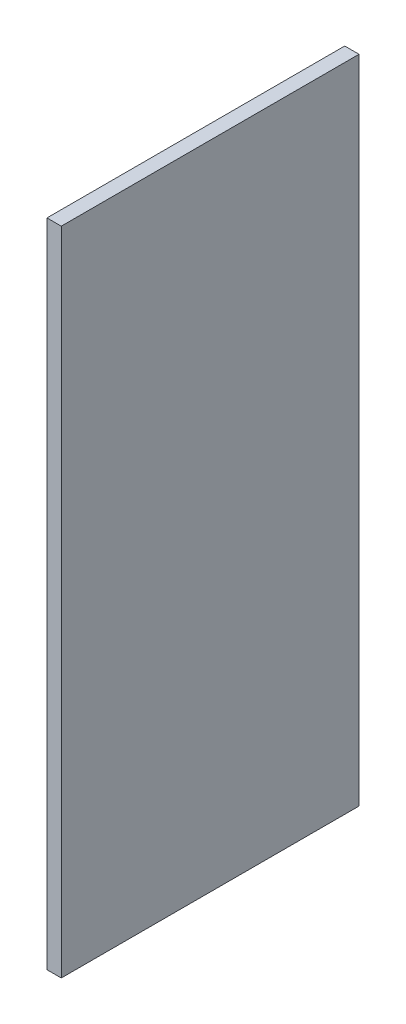
ISO-10303-21;
HEADER;
FILE_DESCRIPTION(('STEP AP214'),'2;1');
FILE_NAME('part.step','',(''),(''),'','','');
FILE_SCHEMA(('AUTOMOTIVE_DESIGN { 1 0 10303 214 1 1 1 1 }'));
ENDSEC;
DATA;
#1=APPLICATION_CONTEXT('core data for automotive mechanical design processes');
#2=APPLICATION_PROTOCOL_DEFINITION('international standard','automotive_design',2000,#1);
#3=PRODUCT_CONTEXT('',#1,'mechanical');
#4=PRODUCT('Part','Part','',(#3));
#5=PRODUCT_RELATED_PRODUCT_CATEGORY('part','',(#4));
#6=PRODUCT_DEFINITION_FORMATION('','',#4);
#7=PRODUCT_DEFINITION_CONTEXT('part definition',#1,'design');
#8=PRODUCT_DEFINITION('design','',#6,#7);
#9=PRODUCT_DEFINITION_SHAPE('','',#8);
#10=(LENGTH_UNIT() NAMED_UNIT(*) SI_UNIT(.MILLI.,.METRE.));
#11=(NAMED_UNIT(*) PLANE_ANGLE_UNIT() SI_UNIT($,.RADIAN.));
#12=(NAMED_UNIT(*) SI_UNIT($,.STERADIAN.) SOLID_ANGLE_UNIT());
#13=UNCERTAINTY_MEASURE_WITH_UNIT(LENGTH_MEASURE(1.E-05),#10,'distance_accuracy_value','');
#14=(GEOMETRIC_REPRESENTATION_CONTEXT(3) GLOBAL_UNCERTAINTY_ASSIGNED_CONTEXT((#13)) GLOBAL_UNIT_ASSIGNED_CONTEXT((#10,
#11,#12)) REPRESENTATION_CONTEXT('',''));
#15=CARTESIAN_POINT('',(0.,0.,0.));
#16=DIRECTION('',(0.,0.,1.));
#17=DIRECTION('',(1.,0.,0.));
#18=AXIS2_PLACEMENT_3D('',#15,#16,#17);
#19=CARTESIAN_POINT('',(185.,870.,187.5));
#20=DIRECTION('',(1.,0.,0.));
#21=DIRECTION('',(0.,0.,-1.));
#22=AXIS2_PLACEMENT_3D('',#19,#20,#21);
#23=PLANE('',#22);
#24=DIRECTION('',(0.,0.,1.));
#25=VECTOR('',#24,1.);
#26=CARTESIAN_POINT('',(185.,50.,187.5));
#27=LINE('',#26,#25);
#28=CARTESIAN_POINT('',(185.,50.,-187.5));
#29=VERTEX_POINT('',#28);
#30=CARTESIAN_POINT('',(185.,50.,187.5));
#31=VERTEX_POINT('',#30);
#32=EDGE_CURVE('E107',#29,#31,#27,.T.);
#33=ORIENTED_EDGE('',*,*,#32,.T.);
#34=DIRECTION('',(0.,-1.,0.));
#35=VECTOR('',#34,1.);
#36=CARTESIAN_POINT('',(185.,870.,187.5));
#37=LINE('',#36,#35);
#38=CARTESIAN_POINT('',(185.,870.,187.5));
#39=VERTEX_POINT('',#38);
#40=EDGE_CURVE('E11',#39,#31,#37,.T.);
#41=ORIENTED_EDGE('',*,*,#40,.F.);
#42=DIRECTION('',(0.,0.,1.));
#43=VECTOR('',#42,1.);
#44=CARTESIAN_POINT('',(185.,870.,187.5));
#45=LINE('',#44,#43);
#46=CARTESIAN_POINT('',(185.,870.,-187.5));
#47=VERTEX_POINT('',#46);
#48=EDGE_CURVE('E91',#47,#39,#45,.T.);
#49=ORIENTED_EDGE('',*,*,#48,.F.);
#50=DIRECTION('',(0.,-1.,0.));
#51=VECTOR('',#50,1.);
#52=CARTESIAN_POINT('',(185.,870.,-187.5));
#53=LINE('',#52,#51);
#54=EDGE_CURVE('E103',#47,#29,#53,.T.);
#55=ORIENTED_EDGE('',*,*,#54,.T.);
#56=EDGE_LOOP('',(#33,#41,#49,#55));
#57=FACE_BOUND('',#56,.T.);
#58=ADVANCED_FACE('F39',(#57),#23,.F.);
#59=CARTESIAN_POINT('',(185.,870.,187.5));
#60=DIRECTION('',(0.,0.,-1.));
#61=DIRECTION('',(-1.,0.,0.));
#62=AXIS2_PLACEMENT_3D('',#59,#60,#61);
#63=PLANE('',#62);
#64=DIRECTION('',(1.,0.,0.));
#65=VECTOR('',#64,1.);
#66=CARTESIAN_POINT('',(185.,50.,187.5));
#67=LINE('',#66,#65);
#68=CARTESIAN_POINT('',(203.,50.,187.5));
#69=VERTEX_POINT('',#68);
#70=EDGE_CURVE('E96',#31,#69,#67,.T.);
#71=ORIENTED_EDGE('',*,*,#70,.T.);
#72=DIRECTION('',(0.,-1.,0.));
#73=VECTOR('',#72,1.);
#74=CARTESIAN_POINT('',(203.,870.,187.5));
#75=LINE('',#74,#73);
#76=CARTESIAN_POINT('',(203.,870.,187.5));
#77=VERTEX_POINT('',#76);
#78=EDGE_CURVE('E48',#77,#69,#75,.T.);
#79=ORIENTED_EDGE('',*,*,#78,.F.);
#80=DIRECTION('',(1.,0.,0.));
#81=VECTOR('',#80,1.);
#82=CARTESIAN_POINT('',(185.,870.,187.5));
#83=LINE('',#82,#81);
#84=EDGE_CURVE('E86',#39,#77,#83,.T.);
#85=ORIENTED_EDGE('',*,*,#84,.F.);
#86=ORIENTED_EDGE('',*,*,#40,.T.);
#87=EDGE_LOOP('',(#71,#79,#85,#86));
#88=FACE_BOUND('',#87,.T.);
#89=ADVANCED_FACE('F95',(#88),#63,.F.);
#90=CARTESIAN_POINT('',(203.,870.,187.5));
#91=DIRECTION('',(-1.,0.,0.));
#92=DIRECTION('',(0.,0.,1.));
#93=AXIS2_PLACEMENT_3D('',#90,#91,#92);
#94=PLANE('',#93);
#95=DIRECTION('',(0.,0.,-1.));
#96=VECTOR('',#95,1.);
#97=CARTESIAN_POINT('',(203.,50.,187.5));
#98=LINE('',#97,#96);
#99=CARTESIAN_POINT('',(203.,50.,-187.5));
#100=VERTEX_POINT('',#99);
#101=EDGE_CURVE('E73',#69,#100,#98,.T.);
#102=ORIENTED_EDGE('',*,*,#101,.T.);
#103=DIRECTION('',(0.,-1.,0.));
#104=VECTOR('',#103,1.);
#105=CARTESIAN_POINT('',(203.,870.,-187.5));
#106=LINE('',#105,#104);
#107=CARTESIAN_POINT('',(203.,870.,-187.5));
#108=VERTEX_POINT('',#107);
#109=EDGE_CURVE('E98',#108,#100,#106,.T.);
#110=ORIENTED_EDGE('',*,*,#109,.F.);
#111=DIRECTION('',(0.,0.,-1.));
#112=VECTOR('',#111,1.);
#113=CARTESIAN_POINT('',(203.,870.,187.5));
#114=LINE('',#113,#112);
#115=EDGE_CURVE('E89',#77,#108,#114,.T.);
#116=ORIENTED_EDGE('',*,*,#115,.F.);
#117=ORIENTED_EDGE('',*,*,#78,.T.);
#118=EDGE_LOOP('',(#102,#110,#116,#117));
#119=FACE_BOUND('',#118,.T.);
#120=ADVANCED_FACE('F99',(#119),#94,.F.);
#121=CARTESIAN_POINT('',(185.,870.,-187.5));
#122=DIRECTION('',(0.,0.,1.));
#123=DIRECTION('',(1.,0.,0.));
#124=AXIS2_PLACEMENT_3D('',#121,#122,#123);
#125=PLANE('',#124);
#126=DIRECTION('',(-1.,0.,0.));
#127=VECTOR('',#126,1.);
#128=CARTESIAN_POINT('',(185.,50.,-187.5));
#129=LINE('',#128,#127);
#130=EDGE_CURVE('E79',#100,#29,#129,.T.);
#131=ORIENTED_EDGE('',*,*,#130,.T.);
#132=ORIENTED_EDGE('',*,*,#54,.F.);
#133=DIRECTION('',(-1.,0.,0.));
#134=VECTOR('',#133,1.);
#135=CARTESIAN_POINT('',(185.,870.,-187.5));
#136=LINE('',#135,#134);
#137=EDGE_CURVE('E56',#108,#47,#136,.T.);
#138=ORIENTED_EDGE('',*,*,#137,.F.);
#139=ORIENTED_EDGE('',*,*,#109,.T.);
#140=EDGE_LOOP('',(#131,#132,#138,#139));
#141=FACE_BOUND('',#140,.T.);
#142=ADVANCED_FACE('F120',(#141),#125,.F.);
#143=CARTESIAN_POINT('',(0.,870.,0.));
#144=DIRECTION('',(0.,-1.,0.));
#145=DIRECTION('',(0.,0.,-1.));
#146=AXIS2_PLACEMENT_3D('',#143,#144,#145);
#147=PLANE('',#146);
#148=ORIENTED_EDGE('',*,*,#48,.T.);
#149=ORIENTED_EDGE('',*,*,#84,.T.);
#150=ORIENTED_EDGE('',*,*,#115,.T.);
#151=ORIENTED_EDGE('',*,*,#137,.T.);
#152=EDGE_LOOP('',(#148,#149,#150,#151));
#153=FACE_BOUND('',#152,.T.);
#154=ADVANCED_FACE('F87',(#153),#147,.F.);
#155=CARTESIAN_POINT('',(0.,50.,0.));
#156=DIRECTION('',(0.,-1.,0.));
#157=DIRECTION('',(0.,0.,-1.));
#158=AXIS2_PLACEMENT_3D('',#155,#156,#157);
#159=PLANE('',#158);
#160=ORIENTED_EDGE('',*,*,#32,.F.);
#161=ORIENTED_EDGE('',*,*,#130,.F.);
#162=ORIENTED_EDGE('',*,*,#101,.F.);
#163=ORIENTED_EDGE('',*,*,#70,.F.);
#164=EDGE_LOOP('',(#160,#161,#162,#163));
#165=FACE_BOUND('',#164,.T.);
#166=ADVANCED_FACE('F123',(#165),#159,.T.);
#167=CLOSED_SHELL('',(#58,#89,#120,#142,#154,#166));
#168=MANIFOLD_SOLID_BREP('B2',#167);
#169=ADVANCED_BREP_SHAPE_REPRESENTATION('',(#18,#168),#14);
#170=SHAPE_DEFINITION_REPRESENTATION(#9,#169);
ENDSEC;
END-ISO-10303-21;
